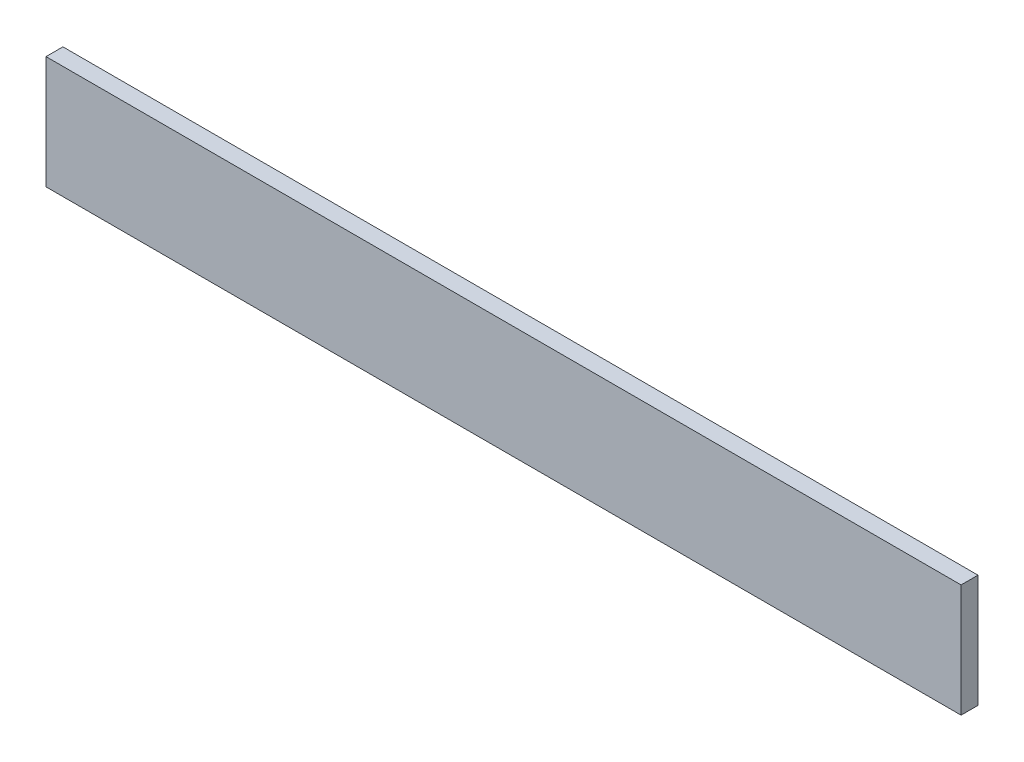
ISO-10303-21;
HEADER;
FILE_DESCRIPTION(('STEP AP214'),'2;1');
FILE_NAME('part.step','',(''),(''),'','','');
FILE_SCHEMA(('AUTOMOTIVE_DESIGN { 1 0 10303 214 1 1 1 1 }'));
ENDSEC;
DATA;
#1=APPLICATION_CONTEXT('core data for automotive mechanical design processes');
#2=APPLICATION_PROTOCOL_DEFINITION('international standard','automotive_design',2000,#1);
#3=PRODUCT_CONTEXT('',#1,'mechanical');
#4=PRODUCT('Part','Part','',(#3));
#5=PRODUCT_RELATED_PRODUCT_CATEGORY('part','',(#4));
#6=PRODUCT_DEFINITION_FORMATION('','',#4);
#7=PRODUCT_DEFINITION_CONTEXT('part definition',#1,'design');
#8=PRODUCT_DEFINITION('design','',#6,#7);
#9=PRODUCT_DEFINITION_SHAPE('','',#8);
#10=(LENGTH_UNIT() NAMED_UNIT(*) SI_UNIT(.MILLI.,.METRE.));
#11=(NAMED_UNIT(*) PLANE_ANGLE_UNIT() SI_UNIT($,.RADIAN.));
#12=(NAMED_UNIT(*) SI_UNIT($,.STERADIAN.) SOLID_ANGLE_UNIT());
#13=UNCERTAINTY_MEASURE_WITH_UNIT(LENGTH_MEASURE(1.E-05),#10,'distance_accuracy_value','');
#14=(GEOMETRIC_REPRESENTATION_CONTEXT(3) GLOBAL_UNCERTAINTY_ASSIGNED_CONTEXT((#13)) GLOBAL_UNIT_ASSIGNED_CONTEXT((#10,
#11,#12)) REPRESENTATION_CONTEXT('',''));
#15=CARTESIAN_POINT('',(0.,0.,0.));
#16=DIRECTION('',(0.,0.,1.));
#17=DIRECTION('',(1.,0.,0.));
#18=AXIS2_PLACEMENT_3D('',#15,#16,#17);
#19=CARTESIAN_POINT('',(405.6,-50.,15.));
#20=DIRECTION('',(-1.,0.,0.));
#21=DIRECTION('',(0.,0.,1.));
#22=AXIS2_PLACEMENT_3D('',#19,#20,#21);
#23=PLANE('',#22);
#24=DIRECTION('',(0.,1.,0.));
#25=VECTOR('',#24,1.);
#26=CARTESIAN_POINT('',(405.6,-50.,0.));
#27=LINE('',#26,#25);
#28=CARTESIAN_POINT('',(405.6,-50.,0.));
#29=VERTEX_POINT('',#28);
#30=CARTESIAN_POINT('',(405.6,50.,0.));
#31=VERTEX_POINT('',#30);
#32=EDGE_CURVE('E95',#29,#31,#27,.T.);
#33=ORIENTED_EDGE('',*,*,#32,.T.);
#34=DIRECTION('',(0.,0.,-1.));
#35=VECTOR('',#34,1.);
#36=CARTESIAN_POINT('',(405.6,50.,15.));
#37=LINE('',#36,#35);
#38=CARTESIAN_POINT('',(405.6,50.,15.));
#39=VERTEX_POINT('',#38);
#40=EDGE_CURVE('E11',#39,#31,#37,.T.);
#41=ORIENTED_EDGE('',*,*,#40,.F.);
#42=DIRECTION('',(0.,1.,0.));
#43=VECTOR('',#42,1.);
#44=CARTESIAN_POINT('',(405.6,-50.,15.));
#45=LINE('',#44,#43);
#46=CARTESIAN_POINT('',(405.6,-50.,15.));
#47=VERTEX_POINT('',#46);
#48=EDGE_CURVE('E83',#47,#39,#45,.T.);
#49=ORIENTED_EDGE('',*,*,#48,.F.);
#50=DIRECTION('',(0.,0.,-1.));
#51=VECTOR('',#50,1.);
#52=CARTESIAN_POINT('',(405.6,-50.,15.));
#53=LINE('',#52,#51);
#54=EDGE_CURVE('E91',#47,#29,#53,.T.);
#55=ORIENTED_EDGE('',*,*,#54,.T.);
#56=EDGE_LOOP('',(#33,#41,#49,#55));
#57=FACE_BOUND('',#56,.T.);
#58=ADVANCED_FACE('F32',(#57),#23,.F.);
#59=CARTESIAN_POINT('',(-405.6,50.,15.));
#60=DIRECTION('',(0.,-1.,0.));
#61=DIRECTION('',(0.,0.,-1.));
#62=AXIS2_PLACEMENT_3D('',#59,#60,#61);
#63=PLANE('',#62);
#64=DIRECTION('',(-1.,0.,0.));
#65=VECTOR('',#64,1.);
#66=CARTESIAN_POINT('',(-405.6,50.,0.));
#67=LINE('',#66,#65);
#68=CARTESIAN_POINT('',(-405.6,50.,0.));
#69=VERTEX_POINT('',#68);
#70=EDGE_CURVE('E87',#31,#69,#67,.T.);
#71=ORIENTED_EDGE('',*,*,#70,.T.);
#72=DIRECTION('',(0.,0.,-1.));
#73=VECTOR('',#72,1.);
#74=CARTESIAN_POINT('',(-405.6,50.,15.));
#75=LINE('',#74,#73);
#76=CARTESIAN_POINT('',(-405.6,50.,15.));
#77=VERTEX_POINT('',#76);
#78=EDGE_CURVE('E40',#77,#69,#75,.T.);
#79=ORIENTED_EDGE('',*,*,#78,.F.);
#80=DIRECTION('',(-1.,0.,0.));
#81=VECTOR('',#80,1.);
#82=CARTESIAN_POINT('',(-405.6,50.,15.));
#83=LINE('',#82,#81);
#84=EDGE_CURVE('E78',#39,#77,#83,.T.);
#85=ORIENTED_EDGE('',*,*,#84,.F.);
#86=ORIENTED_EDGE('',*,*,#40,.T.);
#87=EDGE_LOOP('',(#71,#79,#85,#86));
#88=FACE_BOUND('',#87,.T.);
#89=ADVANCED_FACE('F86',(#88),#63,.F.);
#90=CARTESIAN_POINT('',(-405.6,-50.,15.));
#91=DIRECTION('',(1.,0.,0.));
#92=DIRECTION('',(0.,0.,-1.));
#93=AXIS2_PLACEMENT_3D('',#90,#91,#92);
#94=PLANE('',#93);
#95=DIRECTION('',(0.,-1.,0.));
#96=VECTOR('',#95,1.);
#97=CARTESIAN_POINT('',(-405.6,-50.,0.));
#98=LINE('',#97,#96);
#99=CARTESIAN_POINT('',(-405.6,-50.,0.));
#100=VERTEX_POINT('',#99);
#101=EDGE_CURVE('E65',#69,#100,#98,.T.);
#102=ORIENTED_EDGE('',*,*,#101,.T.);
#103=DIRECTION('',(0.,0.,-1.));
#104=VECTOR('',#103,1.);
#105=CARTESIAN_POINT('',(-405.6,-50.,15.));
#106=LINE('',#105,#104);
#107=CARTESIAN_POINT('',(-405.6,-50.,15.));
#108=VERTEX_POINT('',#107);
#109=EDGE_CURVE('E88',#108,#100,#106,.T.);
#110=ORIENTED_EDGE('',*,*,#109,.F.);
#111=DIRECTION('',(0.,-1.,0.));
#112=VECTOR('',#111,1.);
#113=CARTESIAN_POINT('',(-405.6,-50.,15.));
#114=LINE('',#113,#112);
#115=EDGE_CURVE('E81',#77,#108,#114,.T.);
#116=ORIENTED_EDGE('',*,*,#115,.F.);
#117=ORIENTED_EDGE('',*,*,#78,.T.);
#118=EDGE_LOOP('',(#102,#110,#116,#117));
#119=FACE_BOUND('',#118,.T.);
#120=ADVANCED_FACE('F89',(#119),#94,.F.);
#121=CARTESIAN_POINT('',(-405.6,-50.,15.));
#122=DIRECTION('',(0.,1.,0.));
#123=DIRECTION('',(0.,0.,1.));
#124=AXIS2_PLACEMENT_3D('',#121,#122,#123);
#125=PLANE('',#124);
#126=DIRECTION('',(1.,0.,0.));
#127=VECTOR('',#126,1.);
#128=CARTESIAN_POINT('',(-405.6,-50.,0.));
#129=LINE('',#128,#127);
#130=EDGE_CURVE('E71',#100,#29,#129,.T.);
#131=ORIENTED_EDGE('',*,*,#130,.T.);
#132=ORIENTED_EDGE('',*,*,#54,.F.);
#133=DIRECTION('',(1.,0.,0.));
#134=VECTOR('',#133,1.);
#135=CARTESIAN_POINT('',(-405.6,-50.,15.));
#136=LINE('',#135,#134);
#137=EDGE_CURVE('E48',#108,#47,#136,.T.);
#138=ORIENTED_EDGE('',*,*,#137,.F.);
#139=ORIENTED_EDGE('',*,*,#109,.T.);
#140=EDGE_LOOP('',(#131,#132,#138,#139));
#141=FACE_BOUND('',#140,.T.);
#142=ADVANCED_FACE('F102',(#141),#125,.F.);
#143=CARTESIAN_POINT('',(0.,0.,15.));
#144=DIRECTION('',(0.,0.,-1.));
#145=DIRECTION('',(-1.,0.,0.));
#146=AXIS2_PLACEMENT_3D('',#143,#144,#145);
#147=PLANE('',#146);
#148=ORIENTED_EDGE('',*,*,#48,.T.);
#149=ORIENTED_EDGE('',*,*,#84,.T.);
#150=ORIENTED_EDGE('',*,*,#115,.T.);
#151=ORIENTED_EDGE('',*,*,#137,.T.);
#152=EDGE_LOOP('',(#148,#149,#150,#151));
#153=FACE_BOUND('',#152,.T.);
#154=ADVANCED_FACE('F79',(#153),#147,.F.);
#155=CARTESIAN_POINT('',(0.,0.,0.));
#156=DIRECTION('',(0.,0.,-1.));
#157=DIRECTION('',(-1.,0.,0.));
#158=AXIS2_PLACEMENT_3D('',#155,#156,#157);
#159=PLANE('',#158);
#160=ORIENTED_EDGE('',*,*,#32,.F.);
#161=ORIENTED_EDGE('',*,*,#130,.F.);
#162=ORIENTED_EDGE('',*,*,#101,.F.);
#163=ORIENTED_EDGE('',*,*,#70,.F.);
#164=EDGE_LOOP('',(#160,#161,#162,#163));
#165=FACE_BOUND('',#164,.T.);
#166=ADVANCED_FACE('F105',(#165),#159,.T.);
#167=CLOSED_SHELL('',(#58,#89,#120,#142,#154,#166));
#168=MANIFOLD_SOLID_BREP('B2',#167);
#169=ADVANCED_BREP_SHAPE_REPRESENTATION('',(#18,#168),#14);
#170=SHAPE_DEFINITION_REPRESENTATION(#9,#169);
ENDSEC;
END-ISO-10303-21;
